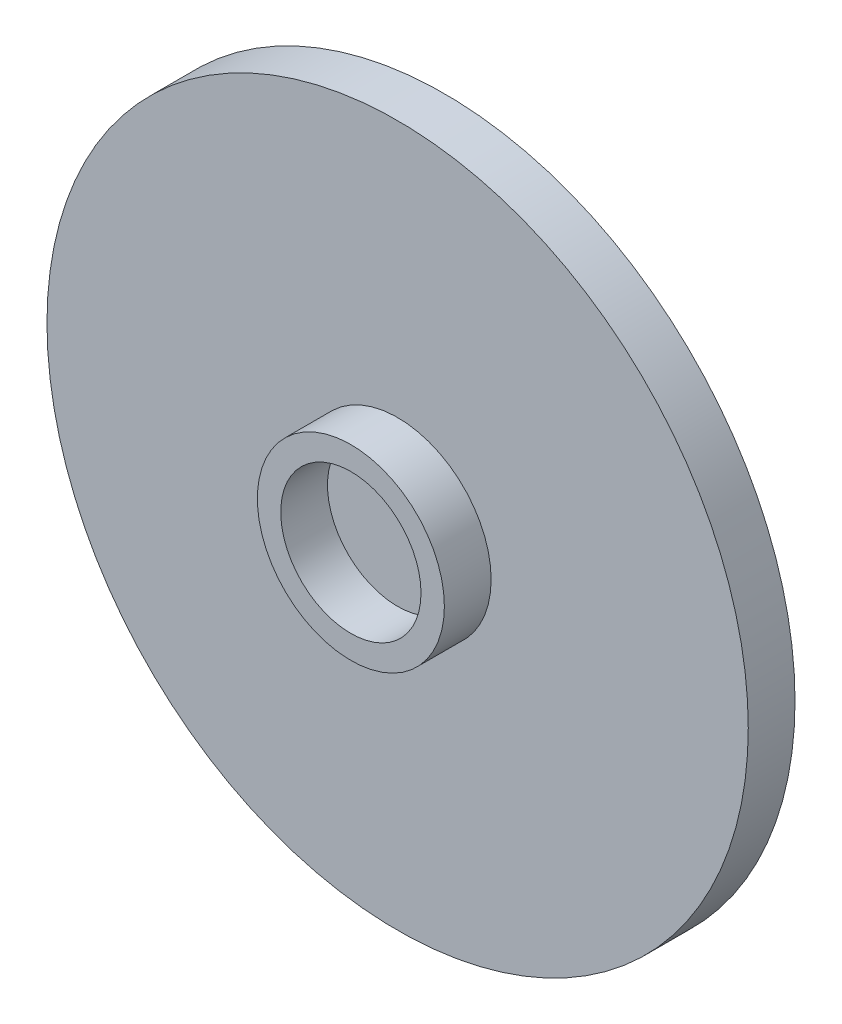
ISO-10303-21;
HEADER;
FILE_DESCRIPTION(('STEP AP214'),'2;1');
FILE_NAME('part.step','',(''),(''),'','','');
FILE_SCHEMA(('AUTOMOTIVE_DESIGN { 1 0 10303 214 1 1 1 1 }'));
ENDSEC;
DATA;
#1=APPLICATION_CONTEXT('core data for automotive mechanical design processes');
#2=APPLICATION_PROTOCOL_DEFINITION('international standard','automotive_design',2000,#1);
#3=PRODUCT_CONTEXT('',#1,'mechanical');
#4=PRODUCT('Part','Part','',(#3));
#5=PRODUCT_RELATED_PRODUCT_CATEGORY('part','',(#4));
#6=PRODUCT_DEFINITION_FORMATION('','',#4);
#7=PRODUCT_DEFINITION_CONTEXT('part definition',#1,'design');
#8=PRODUCT_DEFINITION('design','',#6,#7);
#9=PRODUCT_DEFINITION_SHAPE('','',#8);
#10=(LENGTH_UNIT() NAMED_UNIT(*) SI_UNIT(.MILLI.,.METRE.));
#11=(NAMED_UNIT(*) PLANE_ANGLE_UNIT() SI_UNIT($,.RADIAN.));
#12=(NAMED_UNIT(*) SI_UNIT($,.STERADIAN.) SOLID_ANGLE_UNIT());
#13=UNCERTAINTY_MEASURE_WITH_UNIT(LENGTH_MEASURE(1.E-05),#10,'distance_accuracy_value','');
#14=(GEOMETRIC_REPRESENTATION_CONTEXT(3) GLOBAL_UNCERTAINTY_ASSIGNED_CONTEXT((#13)) GLOBAL_UNIT_ASSIGNED_CONTEXT((#10,
#11,#12)) REPRESENTATION_CONTEXT('',''));
#15=CARTESIAN_POINT('',(0.,0.,0.));
#16=DIRECTION('',(0.,0.,1.));
#17=DIRECTION('',(1.,0.,0.));
#18=AXIS2_PLACEMENT_3D('',#15,#16,#17);
#19=CARTESIAN_POINT('',(0.,0.,1.5875));
#20=DIRECTION('',(0.,0.,-1.));
#21=DIRECTION('',(-1.,0.,0.));
#22=AXIS2_PLACEMENT_3D('',#19,#20,#21);
#23=CYLINDRICAL_SURFACE('',#22,11.90625);
#24=CARTESIAN_POINT('',(0.,0.,1.5875));
#25=DIRECTION('',(0.,0.,1.));
#26=DIRECTION('',(1.,0.,0.));
#27=AXIS2_PLACEMENT_3D('',#24,#25,#26);
#28=CIRCLE('',#27,11.90625);
#29=CARTESIAN_POINT('',(11.90625,0.,1.5875));
#30=VERTEX_POINT('',#29);
#31=EDGE_CURVE('E44',#30,#30,#28,.T.);
#32=ORIENTED_EDGE('',*,*,#31,.F.);
#33=EDGE_LOOP('',(#32));
#34=FACE_BOUND('',#33,.T.);
#35=CARTESIAN_POINT('',(0.,0.,0.));
#36=DIRECTION('',(0.,0.,1.));
#37=DIRECTION('',(1.,0.,0.));
#38=AXIS2_PLACEMENT_3D('',#35,#36,#37);
#39=CIRCLE('',#38,11.90625);
#40=CARTESIAN_POINT('',(11.90625,0.,0.));
#41=VERTEX_POINT('',#40);
#42=EDGE_CURVE('E48',#41,#41,#39,.T.);
#43=ORIENTED_EDGE('',*,*,#42,.T.);
#44=EDGE_LOOP('',(#43));
#45=FACE_BOUND('',#44,.T.);
#46=ADVANCED_FACE('F38',(#34,#45),#23,.T.);
#47=CARTESIAN_POINT('',(0.,0.,1.5875));
#48=DIRECTION('',(0.,0.,1.));
#49=DIRECTION('',(1.,0.,0.));
#50=AXIS2_PLACEMENT_3D('',#47,#48,#49);
#51=PLANE('',#50);
#52=CARTESIAN_POINT('',(0.,0.,1.5875));
#53=DIRECTION('',(0.,0.,1.));
#54=DIRECTION('',(1.,0.,0.));
#55=AXIS2_PLACEMENT_3D('',#52,#53,#54);
#56=CIRCLE('',#55,3.175);
#57=CARTESIAN_POINT('',(3.175,0.,1.5875));
#58=VERTEX_POINT('',#57);
#59=EDGE_CURVE('E55',#58,#58,#56,.T.);
#60=ORIENTED_EDGE('',*,*,#59,.F.);
#61=EDGE_LOOP('',(#60));
#62=FACE_BOUND('',#61,.T.);
#63=ORIENTED_EDGE('',*,*,#31,.T.);
#64=EDGE_LOOP('',(#63));
#65=FACE_BOUND('',#64,.T.);
#66=ADVANCED_FACE('F78',(#62,#65),#51,.T.);
#67=CARTESIAN_POINT('',(0.,0.,0.));
#68=DIRECTION('',(0.,0.,1.));
#69=DIRECTION('',(1.,0.,0.));
#70=AXIS2_PLACEMENT_3D('',#67,#68,#69);
#71=PLANE('',#70);
#72=ORIENTED_EDGE('',*,*,#42,.F.);
#73=EDGE_LOOP('',(#72));
#74=FACE_BOUND('',#73,.T.);
#75=ADVANCED_FACE('F69',(#74),#71,.F.);
#76=CARTESIAN_POINT('',(0.,0.,3.175));
#77=DIRECTION('',(0.,0.,1.));
#78=DIRECTION('',(1.,0.,0.));
#79=AXIS2_PLACEMENT_3D('',#76,#77,#78);
#80=PLANE('',#79);
#81=CARTESIAN_POINT('',(0.,0.,3.175));
#82=DIRECTION('',(0.,0.,1.));
#83=DIRECTION('',(1.,0.,0.));
#84=AXIS2_PLACEMENT_3D('',#81,#82,#83);
#85=CIRCLE('',#84,3.175);
#86=CARTESIAN_POINT('',(3.175,0.,3.175));
#87=VERTEX_POINT('',#86);
#88=EDGE_CURVE('E53',#87,#87,#85,.T.);
#89=ORIENTED_EDGE('',*,*,#88,.T.);
#90=EDGE_LOOP('',(#89));
#91=FACE_BOUND('',#90,.T.);
#92=CARTESIAN_POINT('',(0.,0.,3.175));
#93=DIRECTION('',(0.,0.,1.));
#94=DIRECTION('',(1.,0.,0.));
#95=AXIS2_PLACEMENT_3D('',#92,#93,#94);
#96=CIRCLE('',#95,2.38125);
#97=CARTESIAN_POINT('',(2.38125,0.,3.175));
#98=VERTEX_POINT('',#97);
#99=EDGE_CURVE('E58',#98,#98,#96,.T.);
#100=ORIENTED_EDGE('',*,*,#99,.F.);
#101=EDGE_LOOP('',(#100));
#102=FACE_BOUND('',#101,.T.);
#103=ADVANCED_FACE('F66',(#91,#102),#80,.T.);
#104=CARTESIAN_POINT('',(0.,0.,3.175));
#105=DIRECTION('',(0.,0.,-1.));
#106=DIRECTION('',(-1.,0.,0.));
#107=AXIS2_PLACEMENT_3D('',#104,#105,#106);
#108=CYLINDRICAL_SURFACE('',#107,3.175);
#109=ORIENTED_EDGE('',*,*,#88,.F.);
#110=EDGE_LOOP('',(#109));
#111=FACE_BOUND('',#110,.T.);
#112=ORIENTED_EDGE('',*,*,#59,.T.);
#113=EDGE_LOOP('',(#112));
#114=FACE_BOUND('',#113,.T.);
#115=ADVANCED_FACE('F68',(#111,#114),#108,.T.);
#116=CARTESIAN_POINT('',(0.,0.,3.175));
#117=DIRECTION('',(0.,0.,-1.));
#118=DIRECTION('',(-1.,0.,0.));
#119=AXIS2_PLACEMENT_3D('',#116,#117,#118);
#120=CYLINDRICAL_SURFACE('',#119,2.38125);
#121=ORIENTED_EDGE('',*,*,#99,.T.);
#122=EDGE_LOOP('',(#121));
#123=FACE_BOUND('',#122,.T.);
#124=CARTESIAN_POINT('',(0.,0.,1.5875));
#125=DIRECTION('',(0.,0.,1.));
#126=DIRECTION('',(1.,0.,0.));
#127=AXIS2_PLACEMENT_3D('',#124,#125,#126);
#128=CIRCLE('',#127,2.38125);
#129=CARTESIAN_POINT('',(2.38125,0.,1.5875));
#130=VERTEX_POINT('',#129);
#131=EDGE_CURVE('E10',#130,#130,#128,.F.);
#132=ORIENTED_EDGE('',*,*,#131,.T.);
#133=EDGE_LOOP('',(#132));
#134=FACE_BOUND('',#133,.T.);
#135=ADVANCED_FACE('F64',(#123,#134),#120,.F.);
#136=ORIENTED_EDGE('',*,*,#131,.F.);
#137=EDGE_LOOP('',(#136));
#138=FACE_BOUND('',#137,.T.);
#139=ADVANCED_FACE('F88',(#138),#51,.T.);
#140=CLOSED_SHELL('',(#46,#66,#75,#103,#115,#135,#139));
#141=MANIFOLD_SOLID_BREP('B2',#140);
#142=ADVANCED_BREP_SHAPE_REPRESENTATION('',(#18,#141),#14);
#143=SHAPE_DEFINITION_REPRESENTATION(#9,#142);
ENDSEC;
END-ISO-10303-21;
